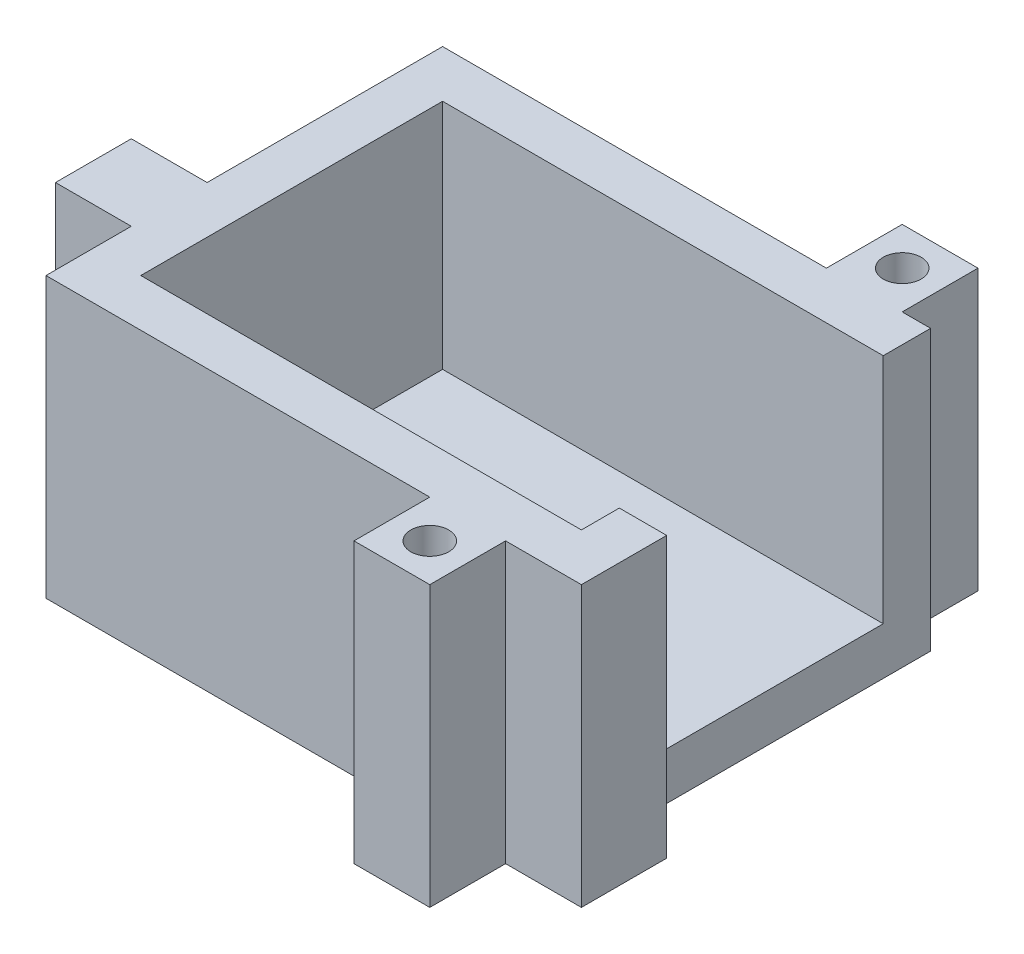
ISO-10303-21;
HEADER;
FILE_DESCRIPTION(('STEP AP214'),'2;1');
FILE_NAME('part.step','',(''),(''),'','','');
FILE_SCHEMA(('AUTOMOTIVE_DESIGN { 1 0 10303 214 1 1 1 1 }'));
ENDSEC;
DATA;
#1=APPLICATION_CONTEXT('core data for automotive mechanical design processes');
#2=APPLICATION_PROTOCOL_DEFINITION('international standard','automotive_design',2000,#1);
#3=PRODUCT_CONTEXT('',#1,'mechanical');
#4=PRODUCT('Part','Part','',(#3));
#5=PRODUCT_RELATED_PRODUCT_CATEGORY('part','',(#4));
#6=PRODUCT_DEFINITION_FORMATION('','',#4);
#7=PRODUCT_DEFINITION_CONTEXT('part definition',#1,'design');
#8=PRODUCT_DEFINITION('design','',#6,#7);
#9=PRODUCT_DEFINITION_SHAPE('','',#8);
#10=(LENGTH_UNIT() NAMED_UNIT(*) SI_UNIT(.MILLI.,.METRE.));
#11=(NAMED_UNIT(*) PLANE_ANGLE_UNIT() SI_UNIT($,.RADIAN.));
#12=(NAMED_UNIT(*) SI_UNIT($,.STERADIAN.) SOLID_ANGLE_UNIT());
#13=UNCERTAINTY_MEASURE_WITH_UNIT(LENGTH_MEASURE(1.E-05),#10,'distance_accuracy_value','');
#14=(GEOMETRIC_REPRESENTATION_CONTEXT(3) GLOBAL_UNCERTAINTY_ASSIGNED_CONTEXT((#13)) GLOBAL_UNIT_ASSIGNED_CONTEXT((#10,
#11,#12)) REPRESENTATION_CONTEXT('',''));
#15=CARTESIAN_POINT('',(0.,0.,0.));
#16=DIRECTION('',(0.,0.,1.));
#17=DIRECTION('',(1.,0.,0.));
#18=AXIS2_PLACEMENT_3D('',#15,#16,#17);
#19=CARTESIAN_POINT('',(0.,24.5,41.85));
#20=DIRECTION('',(1.,0.,0.));
#21=DIRECTION('',(0.,0.,-1.));
#22=AXIS2_PLACEMENT_3D('',#19,#20,#21);
#23=PLANE('',#22);
#24=DIRECTION('',(0.,1.,0.));
#25=VECTOR('',#24,1.);
#26=CARTESIAN_POINT('',(0.,24.5,32.85));
#27=LINE('',#26,#25);
#28=CARTESIAN_POINT('',(0.,-5.,32.85));
#29=VERTEX_POINT('',#28);
#30=CARTESIAN_POINT('',(0.,24.5,32.85));
#31=VERTEX_POINT('',#30);
#32=EDGE_CURVE('E223',#29,#31,#27,.T.);
#33=ORIENTED_EDGE('',*,*,#32,.F.);
#34=DIRECTION('',(0.,0.,-1.));
#35=VECTOR('',#34,1.);
#36=CARTESIAN_POINT('',(0.,-5.,41.85));
#37=LINE('',#36,#35);
#38=CARTESIAN_POINT('',(0.,-5.,41.85));
#39=VERTEX_POINT('',#38);
#40=EDGE_CURVE('E316',#39,#29,#37,.T.);
#41=ORIENTED_EDGE('',*,*,#40,.F.);
#42=DIRECTION('',(0.,-1.,0.));
#43=VECTOR('',#42,1.);
#44=CARTESIAN_POINT('',(0.,24.5,41.85));
#45=LINE('',#44,#43);
#46=CARTESIAN_POINT('',(0.,24.5,41.85));
#47=VERTEX_POINT('',#46);
#48=EDGE_CURVE('E44',#47,#39,#45,.T.);
#49=ORIENTED_EDGE('',*,*,#48,.F.);
#50=DIRECTION('',(0.,0.,1.));
#51=VECTOR('',#50,1.);
#52=CARTESIAN_POINT('',(0.,24.5,41.85));
#53=LINE('',#52,#51);
#54=EDGE_CURVE('E51',#31,#47,#53,.T.);
#55=ORIENTED_EDGE('',*,*,#54,.F.);
#56=EDGE_LOOP('',(#33,#41,#49,#55));
#57=FACE_BOUND('',#56,.T.);
#58=ADVANCED_FACE('F37',(#57),#23,.F.);
#59=DIRECTION('',(0.,-1.,0.));
#60=VECTOR('',#59,1.);
#61=CARTESIAN_POINT('',(0.,24.5,24.85));
#62=LINE('',#61,#60);
#63=CARTESIAN_POINT('',(0.,24.5,24.85));
#64=VERTEX_POINT('',#63);
#65=CARTESIAN_POINT('',(0.,-5.,24.85));
#66=VERTEX_POINT('',#65);
#67=EDGE_CURVE('E59',#64,#66,#62,.T.);
#68=ORIENTED_EDGE('',*,*,#67,.F.);
#69=CARTESIAN_POINT('',(0.,24.5,0.));
#70=VERTEX_POINT('',#69);
#71=EDGE_CURVE('E322',#70,#64,#53,.T.);
#72=ORIENTED_EDGE('',*,*,#71,.F.);
#73=DIRECTION('',(0.,-1.,0.));
#74=VECTOR('',#73,1.);
#75=CARTESIAN_POINT('',(0.,24.5,0.));
#76=LINE('',#75,#74);
#77=CARTESIAN_POINT('',(0.,-5.,0.));
#78=VERTEX_POINT('',#77);
#79=EDGE_CURVE('E345',#70,#78,#76,.T.);
#80=ORIENTED_EDGE('',*,*,#79,.T.);
#81=EDGE_CURVE('E315',#66,#78,#37,.T.);
#82=ORIENTED_EDGE('',*,*,#81,.F.);
#83=EDGE_LOOP('',(#68,#72,#80,#82));
#84=FACE_BOUND('',#83,.T.);
#85=ADVANCED_FACE('F416',(#84),#23,.F.);
#86=CARTESIAN_POINT('',(0.,24.5,0.));
#87=DIRECTION('',(0.,-1.,0.));
#88=DIRECTION('',(0.,0.,-1.));
#89=AXIS2_PLACEMENT_3D('',#86,#87,#88);
#90=PLANE('',#89);
#91=CARTESIAN_POINT('',(44.5,24.5,45.85));
#92=DIRECTION('',(0.,1.,0.));
#93=DIRECTION('',(0.,0.,1.));
#94=AXIS2_PLACEMENT_3D('',#91,#92,#93);
#95=CIRCLE('',#94,2.);
#96=CARTESIAN_POINT('',(44.5,24.5,47.85));
#97=VERTEX_POINT('',#96);
#98=EDGE_CURVE('E263',#97,#97,#95,.T.);
#99=ORIENTED_EDGE('',*,*,#98,.F.);
#100=EDGE_LOOP('',(#99));
#101=FACE_BOUND('',#100,.T.);
#102=DIRECTION('',(1.,0.,0.));
#103=VECTOR('',#102,1.);
#104=CARTESIAN_POINT('',(56.5,24.5,41.85));
#105=LINE('',#104,#103);
#106=CARTESIAN_POINT('',(40.5,24.5,41.85));
#107=VERTEX_POINT('',#106);
#108=EDGE_CURVE('E325',#47,#107,#105,.T.);
#109=ORIENTED_EDGE('',*,*,#108,.T.);
#110=DIRECTION('',(0.,0.,1.));
#111=VECTOR('',#110,1.);
#112=CARTESIAN_POINT('',(40.5,24.5,0.));
#113=LINE('',#112,#111);
#114=CARTESIAN_POINT('',(40.5,24.5,49.85));
#115=VERTEX_POINT('',#114);
#116=EDGE_CURVE('E207',#107,#115,#113,.T.);
#117=ORIENTED_EDGE('',*,*,#116,.T.);
#118=DIRECTION('',(-1.,0.,0.));
#119=VECTOR('',#118,1.);
#120=CARTESIAN_POINT('',(48.5,24.5,49.85));
#121=LINE('',#120,#119);
#122=CARTESIAN_POINT('',(48.5,24.5,49.85));
#123=VERTEX_POINT('',#122);
#124=EDGE_CURVE('E271',#123,#115,#121,.T.);
#125=ORIENTED_EDGE('',*,*,#124,.F.);
#126=DIRECTION('',(0.,0.,-1.));
#127=VECTOR('',#126,1.);
#128=CARTESIAN_POINT('',(48.5,24.5,49.85));
#129=LINE('',#128,#127);
#130=CARTESIAN_POINT('',(48.5,24.5,41.85));
#131=VERTEX_POINT('',#130);
#132=EDGE_CURVE('E280',#123,#131,#129,.T.);
#133=ORIENTED_EDGE('',*,*,#132,.T.);
#134=CARTESIAN_POINT('',(56.5,24.5,41.85));
#135=VERTEX_POINT('',#134);
#136=EDGE_CURVE('E324',#131,#135,#105,.T.);
#137=ORIENTED_EDGE('',*,*,#136,.T.);
#138=DIRECTION('',(0.,0.,-1.));
#139=VECTOR('',#138,1.);
#140=CARTESIAN_POINT('',(56.5,24.5,32.85));
#141=LINE('',#140,#139);
#142=CARTESIAN_POINT('',(56.5,24.5,32.85));
#143=VERTEX_POINT('',#142);
#144=EDGE_CURVE('E327',#135,#143,#141,.T.);
#145=ORIENTED_EDGE('',*,*,#144,.T.);
#146=DIRECTION('',(-1.,0.,0.));
#147=VECTOR('',#146,1.);
#148=CARTESIAN_POINT('',(51.5,24.5,32.85));
#149=LINE('',#148,#147);
#150=CARTESIAN_POINT('',(51.5,24.5,32.85));
#151=VERTEX_POINT('',#150);
#152=EDGE_CURVE('E329',#143,#151,#149,.T.);
#153=ORIENTED_EDGE('',*,*,#152,.T.);
#154=DIRECTION('',(0.,0.,1.));
#155=VECTOR('',#154,1.);
#156=CARTESIAN_POINT('',(51.5,24.5,36.85));
#157=LINE('',#156,#155);
#158=CARTESIAN_POINT('',(51.5,24.5,36.85));
#159=VERTEX_POINT('',#158);
#160=EDGE_CURVE('E331',#151,#159,#157,.T.);
#161=ORIENTED_EDGE('',*,*,#160,.T.);
#162=DIRECTION('',(-1.,0.,0.));
#163=VECTOR('',#162,1.);
#164=CARTESIAN_POINT('',(4.99999999999999,24.5,36.85));
#165=LINE('',#164,#163);
#166=CARTESIAN_POINT('',(4.99999999999999,24.5,36.85));
#167=VERTEX_POINT('',#166);
#168=EDGE_CURVE('E333',#159,#167,#165,.T.);
#169=ORIENTED_EDGE('',*,*,#168,.T.);
#170=DIRECTION('',(0.,0.,-1.));
#171=VECTOR('',#170,1.);
#172=CARTESIAN_POINT('',(4.99999999999999,24.5,5.));
#173=LINE('',#172,#171);
#174=CARTESIAN_POINT('',(4.99999999999999,24.5,5.));
#175=VERTEX_POINT('',#174);
#176=EDGE_CURVE('E335',#167,#175,#173,.T.);
#177=ORIENTED_EDGE('',*,*,#176,.T.);
#178=DIRECTION('',(1.,0.,0.));
#179=VECTOR('',#178,1.);
#180=CARTESIAN_POINT('',(51.5,24.5,5.));
#181=LINE('',#180,#179);
#182=CARTESIAN_POINT('',(51.5,24.5,5.));
#183=VERTEX_POINT('',#182);
#184=EDGE_CURVE('E337',#175,#183,#181,.T.);
#185=ORIENTED_EDGE('',*,*,#184,.T.);
#186=DIRECTION('',(0.,0.,-1.));
#187=VECTOR('',#186,1.);
#188=CARTESIAN_POINT('',(51.5,24.5,0.));
#189=LINE('',#188,#187);
#190=CARTESIAN_POINT('',(51.5,24.5,0.));
#191=VERTEX_POINT('',#190);
#192=EDGE_CURVE('E339',#183,#191,#189,.T.);
#193=ORIENTED_EDGE('',*,*,#192,.T.);
#194=DIRECTION('',(-1.,0.,0.));
#195=VECTOR('',#194,1.);
#196=CARTESIAN_POINT('',(0.,24.5,0.));
#197=LINE('',#196,#195);
#198=CARTESIAN_POINT('',(48.5,24.5,0.));
#199=VERTEX_POINT('',#198);
#200=EDGE_CURVE('E342',#191,#199,#197,.T.);
#201=ORIENTED_EDGE('',*,*,#200,.T.);
#202=DIRECTION('',(0.,0.,1.));
#203=VECTOR('',#202,1.);
#204=CARTESIAN_POINT('',(48.5,24.5,-8.));
#205=LINE('',#204,#203);
#206=CARTESIAN_POINT('',(48.5,24.5,-8.));
#207=VERTEX_POINT('',#206);
#208=EDGE_CURVE('E293',#207,#199,#205,.T.);
#209=ORIENTED_EDGE('',*,*,#208,.F.);
#210=DIRECTION('',(1.,0.,0.));
#211=VECTOR('',#210,1.);
#212=CARTESIAN_POINT('',(48.5,24.5,-8.));
#213=LINE('',#212,#211);
#214=CARTESIAN_POINT('',(40.5,24.5,-8.));
#215=VERTEX_POINT('',#214);
#216=EDGE_CURVE('E291',#215,#207,#213,.T.);
#217=ORIENTED_EDGE('',*,*,#216,.F.);
#218=DIRECTION('',(0.,0.,1.));
#219=VECTOR('',#218,1.);
#220=CARTESIAN_POINT('',(40.5,24.5,-8.));
#221=LINE('',#220,#219);
#222=CARTESIAN_POINT('',(40.5,24.5,0.));
#223=VERTEX_POINT('',#222);
#224=EDGE_CURVE('E297',#215,#223,#221,.T.);
#225=ORIENTED_EDGE('',*,*,#224,.T.);
#226=EDGE_CURVE('E341',#223,#70,#197,.T.);
#227=ORIENTED_EDGE('',*,*,#226,.T.);
#228=ORIENTED_EDGE('',*,*,#71,.T.);
#229=DIRECTION('',(1.,0.,0.));
#230=VECTOR('',#229,1.);
#231=CARTESIAN_POINT('',(-8.,24.5,24.85));
#232=LINE('',#231,#230);
#233=CARTESIAN_POINT('',(-8.,24.5,24.85));
#234=VERTEX_POINT('',#233);
#235=EDGE_CURVE('E244',#234,#64,#232,.T.);
#236=ORIENTED_EDGE('',*,*,#235,.F.);
#237=DIRECTION('',(0.,0.,-1.));
#238=VECTOR('',#237,1.);
#239=CARTESIAN_POINT('',(-8.,24.5,32.85));
#240=LINE('',#239,#238);
#241=CARTESIAN_POINT('',(-8.,24.5,32.85));
#242=VERTEX_POINT('',#241);
#243=EDGE_CURVE('E229',#242,#234,#240,.T.);
#244=ORIENTED_EDGE('',*,*,#243,.F.);
#245=DIRECTION('',(1.,0.,0.));
#246=VECTOR('',#245,1.);
#247=CARTESIAN_POINT('',(-8.,24.5,32.85));
#248=LINE('',#247,#246);
#249=EDGE_CURVE('E247',#242,#31,#248,.T.);
#250=ORIENTED_EDGE('',*,*,#249,.T.);
#251=ORIENTED_EDGE('',*,*,#54,.T.);
#252=EDGE_LOOP('',(#109,#117,#125,#133,#137,#145,#153,#161,#169,#177,#185,#193,#201,#209,#217,
#225,#227,#228,#236,#244,#250,#251));
#253=FACE_BOUND('',#252,.T.);
#254=CARTESIAN_POINT('',(44.5,24.5,-4.));
#255=DIRECTION('',(0.,1.,0.));
#256=DIRECTION('',(0.,0.,1.));
#257=AXIS2_PLACEMENT_3D('',#254,#255,#256);
#258=CIRCLE('',#257,2.);
#259=CARTESIAN_POINT('',(44.5,24.5,-2.));
#260=VERTEX_POINT('',#259);
#261=EDGE_CURVE('E260',#260,#260,#258,.T.);
#262=ORIENTED_EDGE('',*,*,#261,.F.);
#263=EDGE_LOOP('',(#262));
#264=FACE_BOUND('',#263,.T.);
#265=ADVANCED_FACE('F399',(#101,#253,#264),#90,.F.);
#266=CARTESIAN_POINT('',(56.5,24.5,41.85));
#267=DIRECTION('',(0.,0.,-1.));
#268=DIRECTION('',(-1.,0.,0.));
#269=AXIS2_PLACEMENT_3D('',#266,#267,#268);
#270=PLANE('',#269);
#271=DIRECTION('',(-1.,0.,0.));
#272=VECTOR('',#271,1.);
#273=CARTESIAN_POINT('',(0.,-5.,41.85));
#274=LINE('',#273,#272);
#275=CARTESIAN_POINT('',(56.5,-5.,41.85));
#276=VERTEX_POINT('',#275);
#277=CARTESIAN_POINT('',(48.5,-5.,41.85));
#278=VERTEX_POINT('',#277);
#279=EDGE_CURVE('E198',#276,#278,#274,.T.);
#280=ORIENTED_EDGE('',*,*,#279,.F.);
#281=DIRECTION('',(0.,-1.,0.));
#282=VECTOR('',#281,1.);
#283=CARTESIAN_POINT('',(56.5,24.5,41.85));
#284=LINE('',#283,#282);
#285=EDGE_CURVE('E378',#135,#276,#284,.T.);
#286=ORIENTED_EDGE('',*,*,#285,.F.);
#287=ORIENTED_EDGE('',*,*,#136,.F.);
#288=DIRECTION('',(0.,1.,0.));
#289=VECTOR('',#288,1.);
#290=CARTESIAN_POINT('',(48.5,24.5,41.85));
#291=LINE('',#290,#289);
#292=EDGE_CURVE('E259',#278,#131,#291,.T.);
#293=ORIENTED_EDGE('',*,*,#292,.F.);
#294=EDGE_LOOP('',(#280,#286,#287,#293));
#295=FACE_BOUND('',#294,.T.);
#296=ADVANCED_FACE('F391',(#295),#270,.F.);
#297=CARTESIAN_POINT('',(40.5,-5.,41.85));
#298=VERTEX_POINT('',#297);
#299=EDGE_CURVE('E189',#298,#39,#274,.T.);
#300=ORIENTED_EDGE('',*,*,#299,.F.);
#301=DIRECTION('',(0.,-1.,0.));
#302=VECTOR('',#301,1.);
#303=CARTESIAN_POINT('',(40.5,142.,41.85));
#304=LINE('',#303,#302);
#305=EDGE_CURVE('E193',#107,#298,#304,.T.);
#306=ORIENTED_EDGE('',*,*,#305,.F.);
#307=ORIENTED_EDGE('',*,*,#108,.F.);
#308=ORIENTED_EDGE('',*,*,#48,.T.);
#309=EDGE_LOOP('',(#300,#306,#307,#308));
#310=FACE_BOUND('',#309,.T.);
#311=ADVANCED_FACE('F191',(#310),#270,.F.);
#312=CARTESIAN_POINT('',(0.,24.5,0.));
#313=DIRECTION('',(0.,0.,1.));
#314=DIRECTION('',(1.,0.,0.));
#315=AXIS2_PLACEMENT_3D('',#312,#313,#314);
#316=PLANE('',#315);
#317=DIRECTION('',(0.,-1.,0.));
#318=VECTOR('',#317,1.);
#319=CARTESIAN_POINT('',(51.5,24.5,0.));
#320=LINE('',#319,#318);
#321=CARTESIAN_POINT('',(51.5,-5.,0.));
#322=VERTEX_POINT('',#321);
#323=EDGE_CURVE('E359',#191,#322,#320,.T.);
#324=ORIENTED_EDGE('',*,*,#323,.T.);
#325=DIRECTION('',(1.,0.,0.));
#326=VECTOR('',#325,1.);
#327=CARTESIAN_POINT('',(0.,-5.,0.));
#328=LINE('',#327,#326);
#329=CARTESIAN_POINT('',(48.5,-5.,0.));
#330=VERTEX_POINT('',#329);
#331=EDGE_CURVE('E318',#330,#322,#328,.T.);
#332=ORIENTED_EDGE('',*,*,#331,.F.);
#333=DIRECTION('',(0.,-1.,0.));
#334=VECTOR('',#333,1.);
#335=CARTESIAN_POINT('',(48.5,24.5,0.));
#336=LINE('',#335,#334);
#337=EDGE_CURVE('E282',#199,#330,#336,.T.);
#338=ORIENTED_EDGE('',*,*,#337,.F.);
#339=ORIENTED_EDGE('',*,*,#200,.F.);
#340=EDGE_LOOP('',(#324,#332,#338,#339));
#341=FACE_BOUND('',#340,.T.);
#342=ADVANCED_FACE('F438',(#341),#316,.F.);
#343=DIRECTION('',(0.,1.,0.));
#344=VECTOR('',#343,1.);
#345=CARTESIAN_POINT('',(40.5,24.5,0.));
#346=LINE('',#345,#344);
#347=CARTESIAN_POINT('',(40.5,-5.,0.));
#348=VERTEX_POINT('',#347);
#349=EDGE_CURVE('E287',#348,#223,#346,.T.);
#350=ORIENTED_EDGE('',*,*,#349,.F.);
#351=EDGE_CURVE('E199',#78,#348,#328,.T.);
#352=ORIENTED_EDGE('',*,*,#351,.F.);
#353=ORIENTED_EDGE('',*,*,#79,.F.);
#354=ORIENTED_EDGE('',*,*,#226,.F.);
#355=EDGE_LOOP('',(#350,#352,#353,#354));
#356=FACE_BOUND('',#355,.T.);
#357=ADVANCED_FACE('F420',(#356),#316,.F.);
#358=CARTESIAN_POINT('',(0.,0.,0.));
#359=DIRECTION('',(0.,-1.,0.));
#360=DIRECTION('',(0.,0.,-1.));
#361=AXIS2_PLACEMENT_3D('',#358,#359,#360);
#362=PLANE('',#361);
#363=DIRECTION('',(0.,0.,1.));
#364=VECTOR('',#363,1.);
#365=CARTESIAN_POINT('',(51.5,0.,36.85));
#366=LINE('',#365,#364);
#367=CARTESIAN_POINT('',(51.5,0.,32.85));
#368=VERTEX_POINT('',#367);
#369=CARTESIAN_POINT('',(51.5,0.,36.85));
#370=VERTEX_POINT('',#369);
#371=EDGE_CURVE('E321',#368,#370,#366,.T.);
#372=ORIENTED_EDGE('',*,*,#371,.F.);
#373=DIRECTION('',(0.,0.,1.));
#374=VECTOR('',#373,1.);
#375=CARTESIAN_POINT('',(51.5,0.,5.));
#376=LINE('',#375,#374);
#377=CARTESIAN_POINT('',(51.5,0.,5.));
#378=VERTEX_POINT('',#377);
#379=EDGE_CURVE('E305',#378,#368,#376,.T.);
#380=ORIENTED_EDGE('',*,*,#379,.F.);
#381=DIRECTION('',(1.,0.,0.));
#382=VECTOR('',#381,1.);
#383=CARTESIAN_POINT('',(51.5,0.,5.));
#384=LINE('',#383,#382);
#385=CARTESIAN_POINT('',(4.99999999999999,0.,5.));
#386=VERTEX_POINT('',#385);
#387=EDGE_CURVE('E354',#386,#378,#384,.T.);
#388=ORIENTED_EDGE('',*,*,#387,.F.);
#389=DIRECTION('',(0.,0.,-1.));
#390=VECTOR('',#389,1.);
#391=CARTESIAN_POINT('',(4.99999999999999,0.,5.));
#392=LINE('',#391,#390);
#393=CARTESIAN_POINT('',(4.99999999999999,0.,36.85));
#394=VERTEX_POINT('',#393);
#395=EDGE_CURVE('E351',#394,#386,#392,.T.);
#396=ORIENTED_EDGE('',*,*,#395,.F.);
#397=DIRECTION('',(-1.,0.,0.));
#398=VECTOR('',#397,1.);
#399=CARTESIAN_POINT('',(4.99999999999999,0.,36.85));
#400=LINE('',#399,#398);
#401=EDGE_CURVE('E348',#370,#394,#400,.T.);
#402=ORIENTED_EDGE('',*,*,#401,.F.);
#403=EDGE_LOOP('',(#372,#380,#388,#396,#402));
#404=FACE_BOUND('',#403,.T.);
#405=ADVANCED_FACE('F452',(#404),#362,.F.);
#406=CARTESIAN_POINT('',(56.5,24.5,32.85));
#407=DIRECTION('',(-1.,0.,0.));
#408=DIRECTION('',(0.,0.,1.));
#409=AXIS2_PLACEMENT_3D('',#406,#407,#408);
#410=PLANE('',#409);
#411=ORIENTED_EDGE('',*,*,#285,.T.);
#412=DIRECTION('',(0.,0.,-1.));
#413=VECTOR('',#412,1.);
#414=CARTESIAN_POINT('',(56.5,-5.,0.));
#415=LINE('',#414,#413);
#416=CARTESIAN_POINT('',(56.5,-5.00000000000001,32.85));
#417=VERTEX_POINT('',#416);
#418=EDGE_CURVE('E11',#276,#417,#415,.T.);
#419=ORIENTED_EDGE('',*,*,#418,.T.);
#420=DIRECTION('',(0.,-1.,0.));
#421=VECTOR('',#420,1.);
#422=CARTESIAN_POINT('',(56.5,24.5,32.85));
#423=LINE('',#422,#421);
#424=EDGE_CURVE('E376',#143,#417,#423,.T.);
#425=ORIENTED_EDGE('',*,*,#424,.F.);
#426=ORIENTED_EDGE('',*,*,#144,.F.);
#427=EDGE_LOOP('',(#411,#419,#425,#426));
#428=FACE_BOUND('',#427,.T.);
#429=ADVANCED_FACE('F383',(#428),#410,.F.);
#430=CARTESIAN_POINT('',(51.5,24.5,32.85));
#431=DIRECTION('',(0.,0.,1.));
#432=DIRECTION('',(1.,0.,0.));
#433=AXIS2_PLACEMENT_3D('',#430,#431,#432);
#434=PLANE('',#433);
#435=ORIENTED_EDGE('',*,*,#424,.T.);
#436=DIRECTION('',(-1.,0.,0.));
#437=VECTOR('',#436,1.);
#438=CARTESIAN_POINT('',(0.,-5.,32.85));
#439=LINE('',#438,#437);
#440=CARTESIAN_POINT('',(51.5,-5.,32.85));
#441=VERTEX_POINT('',#440);
#442=EDGE_CURVE('E310',#417,#441,#439,.T.);
#443=ORIENTED_EDGE('',*,*,#442,.T.);
#444=DIRECTION('',(0.,1.,0.));
#445=VECTOR('',#444,1.);
#446=CARTESIAN_POINT('',(51.5,-26.,32.85));
#447=LINE('',#446,#445);
#448=EDGE_CURVE('E307',#441,#368,#447,.T.);
#449=ORIENTED_EDGE('',*,*,#448,.T.);
#450=DIRECTION('',(0.,-1.,0.));
#451=VECTOR('',#450,1.);
#452=CARTESIAN_POINT('',(51.5,24.5,32.85));
#453=LINE('',#452,#451);
#454=EDGE_CURVE('E373',#151,#368,#453,.T.);
#455=ORIENTED_EDGE('',*,*,#454,.F.);
#456=ORIENTED_EDGE('',*,*,#152,.F.);
#457=EDGE_LOOP('',(#435,#443,#449,#455,#456));
#458=FACE_BOUND('',#457,.T.);
#459=ADVANCED_FACE('F448',(#458),#434,.F.);
#460=CARTESIAN_POINT('',(51.5,24.5,36.85));
#461=DIRECTION('',(1.,0.,0.));
#462=DIRECTION('',(0.,0.,-1.));
#463=AXIS2_PLACEMENT_3D('',#460,#461,#462);
#464=PLANE('',#463);
#465=ORIENTED_EDGE('',*,*,#371,.T.);
#466=DIRECTION('',(0.,-1.,0.));
#467=VECTOR('',#466,1.);
#468=CARTESIAN_POINT('',(51.5,24.5,36.85));
#469=LINE('',#468,#467);
#470=EDGE_CURVE('E370',#159,#370,#469,.T.);
#471=ORIENTED_EDGE('',*,*,#470,.F.);
#472=ORIENTED_EDGE('',*,*,#160,.F.);
#473=ORIENTED_EDGE('',*,*,#454,.T.);
#474=EDGE_LOOP('',(#465,#471,#472,#473));
#475=FACE_BOUND('',#474,.T.);
#476=ADVANCED_FACE('F455',(#475),#464,.F.);
#477=CARTESIAN_POINT('',(4.99999999999999,24.5,36.85));
#478=DIRECTION('',(0.,0.,1.));
#479=DIRECTION('',(1.,0.,0.));
#480=AXIS2_PLACEMENT_3D('',#477,#478,#479);
#481=PLANE('',#480);
#482=DIRECTION('',(0.,-1.,0.));
#483=VECTOR('',#482,1.);
#484=CARTESIAN_POINT('',(4.99999999999999,24.5,36.85));
#485=LINE('',#484,#483);
#486=EDGE_CURVE('E367',#167,#394,#485,.T.);
#487=ORIENTED_EDGE('',*,*,#486,.F.);
#488=ORIENTED_EDGE('',*,*,#168,.F.);
#489=ORIENTED_EDGE('',*,*,#470,.T.);
#490=ORIENTED_EDGE('',*,*,#401,.T.);
#491=EDGE_LOOP('',(#487,#488,#489,#490));
#492=FACE_BOUND('',#491,.T.);
#493=ADVANCED_FACE('F461',(#492),#481,.F.);
#494=CARTESIAN_POINT('',(4.99999999999999,24.5,5.));
#495=DIRECTION('',(-1.,0.,0.));
#496=DIRECTION('',(0.,0.,1.));
#497=AXIS2_PLACEMENT_3D('',#494,#495,#496);
#498=PLANE('',#497);
#499=ORIENTED_EDGE('',*,*,#395,.T.);
#500=DIRECTION('',(0.,-1.,0.));
#501=VECTOR('',#500,1.);
#502=CARTESIAN_POINT('',(4.99999999999999,24.5,5.));
#503=LINE('',#502,#501);
#504=EDGE_CURVE('E364',#175,#386,#503,.T.);
#505=ORIENTED_EDGE('',*,*,#504,.F.);
#506=ORIENTED_EDGE('',*,*,#176,.F.);
#507=ORIENTED_EDGE('',*,*,#486,.T.);
#508=EDGE_LOOP('',(#499,#505,#506,#507));
#509=FACE_BOUND('',#508,.T.);
#510=ADVANCED_FACE('F463',(#509),#498,.F.);
#511=CARTESIAN_POINT('',(51.5,24.5,5.));
#512=DIRECTION('',(0.,0.,-1.));
#513=DIRECTION('',(-1.,0.,0.));
#514=AXIS2_PLACEMENT_3D('',#511,#512,#513);
#515=PLANE('',#514);
#516=ORIENTED_EDGE('',*,*,#387,.T.);
#517=DIRECTION('',(0.,-1.,0.));
#518=VECTOR('',#517,1.);
#519=CARTESIAN_POINT('',(51.5,24.5,5.));
#520=LINE('',#519,#518);
#521=EDGE_CURVE('E361',#183,#378,#520,.T.);
#522=ORIENTED_EDGE('',*,*,#521,.F.);
#523=ORIENTED_EDGE('',*,*,#184,.F.);
#524=ORIENTED_EDGE('',*,*,#504,.T.);
#525=EDGE_LOOP('',(#516,#522,#523,#524));
#526=FACE_BOUND('',#525,.T.);
#527=ADVANCED_FACE('F467',(#526),#515,.F.);
#528=CARTESIAN_POINT('',(51.5,24.5,0.));
#529=DIRECTION('',(-1.,0.,0.));
#530=DIRECTION('',(0.,0.,1.));
#531=AXIS2_PLACEMENT_3D('',#528,#529,#530);
#532=PLANE('',#531);
#533=ORIENTED_EDGE('',*,*,#521,.T.);
#534=ORIENTED_EDGE('',*,*,#379,.T.);
#535=ORIENTED_EDGE('',*,*,#448,.F.);
#536=DIRECTION('',(0.,0.,-1.));
#537=VECTOR('',#536,1.);
#538=CARTESIAN_POINT('',(51.5,-5.,0.));
#539=LINE('',#538,#537);
#540=EDGE_CURVE('E312',#441,#322,#539,.T.);
#541=ORIENTED_EDGE('',*,*,#540,.T.);
#542=ORIENTED_EDGE('',*,*,#323,.F.);
#543=ORIENTED_EDGE('',*,*,#192,.F.);
#544=EDGE_LOOP('',(#533,#534,#535,#541,#542,#543));
#545=FACE_BOUND('',#544,.T.);
#546=ADVANCED_FACE('F444',(#545),#532,.F.);
#547=CARTESIAN_POINT('',(0.,-5.,0.));
#548=DIRECTION('',(0.,-1.,0.));
#549=DIRECTION('',(0.,0.,-1.));
#550=AXIS2_PLACEMENT_3D('',#547,#548,#549);
#551=PLANE('',#550);
#552=DIRECTION('',(0.,0.,1.));
#553=VECTOR('',#552,1.);
#554=CARTESIAN_POINT('',(40.5,-5.,49.85));
#555=LINE('',#554,#553);
#556=CARTESIAN_POINT('',(40.5,-5.,49.85));
#557=VERTEX_POINT('',#556);
#558=EDGE_CURVE('E204',#298,#557,#555,.T.);
#559=ORIENTED_EDGE('',*,*,#558,.F.);
#560=ORIENTED_EDGE('',*,*,#299,.T.);
#561=ORIENTED_EDGE('',*,*,#40,.T.);
#562=DIRECTION('',(1.,0.,0.));
#563=VECTOR('',#562,1.);
#564=CARTESIAN_POINT('',(-8.,-5.,32.85));
#565=LINE('',#564,#563);
#566=CARTESIAN_POINT('',(-8.,-5.,32.85));
#567=VERTEX_POINT('',#566);
#568=EDGE_CURVE('E235',#567,#29,#565,.T.);
#569=ORIENTED_EDGE('',*,*,#568,.F.);
#570=DIRECTION('',(0.,0.,1.));
#571=VECTOR('',#570,1.);
#572=CARTESIAN_POINT('',(-8.,-5.,32.85));
#573=LINE('',#572,#571);
#574=CARTESIAN_POINT('',(-8.,-5.,24.85));
#575=VERTEX_POINT('',#574);
#576=EDGE_CURVE('E233',#575,#567,#573,.T.);
#577=ORIENTED_EDGE('',*,*,#576,.F.);
#578=DIRECTION('',(1.,0.,0.));
#579=VECTOR('',#578,1.);
#580=CARTESIAN_POINT('',(-8.,-5.,24.85));
#581=LINE('',#580,#579);
#582=EDGE_CURVE('E241',#575,#66,#581,.T.);
#583=ORIENTED_EDGE('',*,*,#582,.T.);
#584=ORIENTED_EDGE('',*,*,#81,.T.);
#585=ORIENTED_EDGE('',*,*,#351,.T.);
#586=DIRECTION('',(0.,0.,1.));
#587=VECTOR('',#586,1.);
#588=CARTESIAN_POINT('',(40.5,-5.,-8.));
#589=LINE('',#588,#587);
#590=CARTESIAN_POINT('',(40.5,-5.,-8.));
#591=VERTEX_POINT('',#590);
#592=EDGE_CURVE('E300',#591,#348,#589,.T.);
#593=ORIENTED_EDGE('',*,*,#592,.F.);
#594=DIRECTION('',(-1.,0.,0.));
#595=VECTOR('',#594,1.);
#596=CARTESIAN_POINT('',(48.5,-5.,-8.));
#597=LINE('',#596,#595);
#598=CARTESIAN_POINT('',(48.5,-5.,-8.));
#599=VERTEX_POINT('',#598);
#600=EDGE_CURVE('E286',#599,#591,#597,.T.);
#601=ORIENTED_EDGE('',*,*,#600,.F.);
#602=DIRECTION('',(0.,0.,1.));
#603=VECTOR('',#602,1.);
#604=CARTESIAN_POINT('',(48.5,-5.,-8.));
#605=LINE('',#604,#603);
#606=EDGE_CURVE('E302',#599,#330,#605,.T.);
#607=ORIENTED_EDGE('',*,*,#606,.T.);
#608=ORIENTED_EDGE('',*,*,#331,.T.);
#609=ORIENTED_EDGE('',*,*,#540,.F.);
#610=ORIENTED_EDGE('',*,*,#442,.F.);
#611=ORIENTED_EDGE('',*,*,#418,.F.);
#612=ORIENTED_EDGE('',*,*,#279,.T.);
#613=DIRECTION('',(0.,0.,-1.));
#614=VECTOR('',#613,1.);
#615=CARTESIAN_POINT('',(48.5,-5.,49.85));
#616=LINE('',#615,#614);
#617=CARTESIAN_POINT('',(48.5,-5.,49.85));
#618=VERTEX_POINT('',#617);
#619=EDGE_CURVE('E275',#618,#278,#616,.T.);
#620=ORIENTED_EDGE('',*,*,#619,.F.);
#621=DIRECTION('',(1.,0.,0.));
#622=VECTOR('',#621,1.);
#623=CARTESIAN_POINT('',(48.5,-5.,49.85));
#624=LINE('',#623,#622);
#625=EDGE_CURVE('E214',#557,#618,#624,.T.);
#626=ORIENTED_EDGE('',*,*,#625,.F.);
#627=EDGE_LOOP('',(#559,#560,#561,#569,#577,#583,#584,#585,#593,#601,#607,#608,#609,#610,#611,
#612,#620,#626));
#628=FACE_BOUND('',#627,.T.);
#629=CARTESIAN_POINT('',(-4.,-5.,28.85));
#630=DIRECTION('',(0.,-1.,0.));
#631=DIRECTION('',(0.,0.,-1.));
#632=AXIS2_PLACEMENT_3D('',#629,#630,#631);
#633=CIRCLE('',#632,2.5);
#634=CARTESIAN_POINT('',(-4.,-5.,26.35));
#635=VERTEX_POINT('',#634);
#636=EDGE_CURVE('E219',#635,#635,#633,.T.);
#637=ORIENTED_EDGE('',*,*,#636,.F.);
#638=EDGE_LOOP('',(#637));
#639=FACE_BOUND('',#638,.T.);
#640=CARTESIAN_POINT('',(44.5,-5.,-4.));
#641=DIRECTION('',(0.,-1.,0.));
#642=DIRECTION('',(0.,0.,-1.));
#643=AXIS2_PLACEMENT_3D('',#640,#641,#642);
#644=CIRCLE('',#643,2.5);
#645=CARTESIAN_POINT('',(44.5,-5.,-6.5));
#646=VERTEX_POINT('',#645);
#647=EDGE_CURVE('E249',#646,#646,#644,.T.);
#648=ORIENTED_EDGE('',*,*,#647,.F.);
#649=EDGE_LOOP('',(#648));
#650=FACE_BOUND('',#649,.T.);
#651=ADVANCED_FACE('F211',(#628,#639,#650),#551,.T.);
#652=CARTESIAN_POINT('',(48.5,24.5,-8.));
#653=DIRECTION('',(-1.,0.,0.));
#654=DIRECTION('',(0.,-1.,0.));
#655=AXIS2_PLACEMENT_3D('',#652,#653,#654);
#656=PLANE('',#655);
#657=ORIENTED_EDGE('',*,*,#337,.T.);
#658=ORIENTED_EDGE('',*,*,#606,.F.);
#659=DIRECTION('',(0.,-1.,0.));
#660=VECTOR('',#659,1.);
#661=CARTESIAN_POINT('',(48.5,24.5,-8.));
#662=LINE('',#661,#660);
#663=EDGE_CURVE('E283',#207,#599,#662,.T.);
#664=ORIENTED_EDGE('',*,*,#663,.F.);
#665=ORIENTED_EDGE('',*,*,#208,.T.);
#666=EDGE_LOOP('',(#657,#658,#664,#665));
#667=FACE_BOUND('',#666,.T.);
#668=ADVANCED_FACE('F433',(#667),#656,.F.);
#669=CARTESIAN_POINT('',(40.5,24.5,-8.));
#670=DIRECTION('',(1.,0.,0.));
#671=DIRECTION('',(0.,0.,-1.));
#672=AXIS2_PLACEMENT_3D('',#669,#670,#671);
#673=PLANE('',#672);
#674=ORIENTED_EDGE('',*,*,#349,.T.);
#675=ORIENTED_EDGE('',*,*,#224,.F.);
#676=DIRECTION('',(0.,1.,0.));
#677=VECTOR('',#676,1.);
#678=CARTESIAN_POINT('',(40.5,24.5,-8.));
#679=LINE('',#678,#677);
#680=EDGE_CURVE('E289',#591,#215,#679,.T.);
#681=ORIENTED_EDGE('',*,*,#680,.F.);
#682=ORIENTED_EDGE('',*,*,#592,.T.);
#683=EDGE_LOOP('',(#674,#675,#681,#682));
#684=FACE_BOUND('',#683,.T.);
#685=ADVANCED_FACE('F425',(#684),#673,.F.);
#686=CARTESIAN_POINT('',(0.,0.,-8.));
#687=DIRECTION('',(0.,0.,-1.));
#688=DIRECTION('',(-1.,0.,0.));
#689=AXIS2_PLACEMENT_3D('',#686,#687,#688);
#690=PLANE('',#689);
#691=ORIENTED_EDGE('',*,*,#663,.T.);
#692=ORIENTED_EDGE('',*,*,#600,.T.);
#693=ORIENTED_EDGE('',*,*,#680,.T.);
#694=ORIENTED_EDGE('',*,*,#216,.T.);
#695=EDGE_LOOP('',(#691,#692,#693,#694));
#696=FACE_BOUND('',#695,.T.);
#697=ADVANCED_FACE('F428',(#696),#690,.T.);
#698=CARTESIAN_POINT('',(48.5,24.5,49.85));
#699=DIRECTION('',(-1.,0.,0.));
#700=DIRECTION('',(0.,0.,1.));
#701=AXIS2_PLACEMENT_3D('',#698,#699,#700);
#702=PLANE('',#701);
#703=ORIENTED_EDGE('',*,*,#292,.T.);
#704=ORIENTED_EDGE('',*,*,#132,.F.);
#705=DIRECTION('',(0.,1.,0.));
#706=VECTOR('',#705,1.);
#707=CARTESIAN_POINT('',(48.5,24.5,49.85));
#708=LINE('',#707,#706);
#709=EDGE_CURVE('E268',#618,#123,#708,.T.);
#710=ORIENTED_EDGE('',*,*,#709,.F.);
#711=ORIENTED_EDGE('',*,*,#619,.T.);
#712=EDGE_LOOP('',(#703,#704,#710,#711));
#713=FACE_BOUND('',#712,.T.);
#714=ADVANCED_FACE('F394',(#713),#702,.F.);
#715=CARTESIAN_POINT('',(0.,0.,49.85));
#716=DIRECTION('',(0.,0.,-1.));
#717=DIRECTION('',(-1.,0.,0.));
#718=AXIS2_PLACEMENT_3D('',#715,#716,#717);
#719=PLANE('',#718);
#720=ORIENTED_EDGE('',*,*,#124,.T.);
#721=DIRECTION('',(0.,-1.,0.));
#722=VECTOR('',#721,1.);
#723=CARTESIAN_POINT('',(40.5,142.,49.85));
#724=LINE('',#723,#722);
#725=EDGE_CURVE('E208',#115,#557,#724,.T.);
#726=ORIENTED_EDGE('',*,*,#725,.T.);
#727=ORIENTED_EDGE('',*,*,#625,.T.);
#728=ORIENTED_EDGE('',*,*,#709,.T.);
#729=EDGE_LOOP('',(#720,#726,#727,#728));
#730=FACE_BOUND('',#729,.T.);
#731=ADVANCED_FACE('F397',(#730),#719,.F.);
#732=CARTESIAN_POINT('',(44.5,14.5,45.85));
#733=DIRECTION('',(0.,1.,0.));
#734=DIRECTION('',(0.,0.,1.));
#735=AXIS2_PLACEMENT_3D('',#732,#733,#734);
#736=CYLINDRICAL_SURFACE('',#735,2.);
#737=CARTESIAN_POINT('',(44.5,14.5,45.85));
#738=DIRECTION('',(0.,1.,0.));
#739=DIRECTION('',(0.,0.,1.));
#740=AXIS2_PLACEMENT_3D('',#737,#738,#739);
#741=CIRCLE('',#740,2.);
#742=CARTESIAN_POINT('',(44.5,14.5,47.85));
#743=VERTEX_POINT('',#742);
#744=EDGE_CURVE('E253',#743,#743,#741,.T.);
#745=ORIENTED_EDGE('',*,*,#744,.F.);
#746=EDGE_LOOP('',(#745));
#747=FACE_BOUND('',#746,.T.);
#748=ORIENTED_EDGE('',*,*,#98,.T.);
#749=EDGE_LOOP('',(#748));
#750=FACE_BOUND('',#749,.T.);
#751=ADVANCED_FACE('F581',(#747,#750),#736,.F.);
#752=CARTESIAN_POINT('',(44.5,14.5,45.85));
#753=DIRECTION('',(0.,1.,0.));
#754=DIRECTION('',(0.,0.,1.));
#755=AXIS2_PLACEMENT_3D('',#752,#753,#754);
#756=PLANE('',#755);
#757=ORIENTED_EDGE('',*,*,#744,.T.);
#758=EDGE_LOOP('',(#757));
#759=FACE_BOUND('',#758,.T.);
#760=ADVANCED_FACE('F586',(#759),#756,.T.);
#761=CARTESIAN_POINT('',(44.5,14.5,-4.));
#762=DIRECTION('',(0.,1.,0.));
#763=DIRECTION('',(0.,0.,1.));
#764=AXIS2_PLACEMENT_3D('',#761,#762,#763);
#765=CYLINDRICAL_SURFACE('',#764,2.);
#766=CARTESIAN_POINT('',(44.5,14.5,-4.));
#767=DIRECTION('',(0.,1.,0.));
#768=DIRECTION('',(0.,0.,1.));
#769=AXIS2_PLACEMENT_3D('',#766,#767,#768);
#770=CIRCLE('',#769,2.);
#771=CARTESIAN_POINT('',(44.5,14.5,-2.));
#772=VERTEX_POINT('',#771);
#773=EDGE_CURVE('E256',#772,#772,#770,.T.);
#774=ORIENTED_EDGE('',*,*,#773,.F.);
#775=EDGE_LOOP('',(#774));
#776=FACE_BOUND('',#775,.T.);
#777=ORIENTED_EDGE('',*,*,#261,.T.);
#778=EDGE_LOOP('',(#777));
#779=FACE_BOUND('',#778,.T.);
#780=ADVANCED_FACE('F597',(#776,#779),#765,.F.);
#781=CARTESIAN_POINT('',(44.5,14.5,-4.));
#782=DIRECTION('',(0.,1.,0.));
#783=DIRECTION('',(0.,0.,1.));
#784=AXIS2_PLACEMENT_3D('',#781,#782,#783);
#785=PLANE('',#784);
#786=ORIENTED_EDGE('',*,*,#773,.T.);
#787=EDGE_LOOP('',(#786));
#788=FACE_BOUND('',#787,.T.);
#789=ADVANCED_FACE('F608',(#788),#785,.T.);
#790=CARTESIAN_POINT('',(44.5,5.,-4.));
#791=DIRECTION('',(0.,-1.,0.));
#792=DIRECTION('',(0.,0.,-1.));
#793=AXIS2_PLACEMENT_3D('',#790,#791,#792);
#794=CYLINDRICAL_SURFACE('',#793,2.5);
#795=CARTESIAN_POINT('',(44.5,5.,-4.));
#796=DIRECTION('',(0.,-1.,0.));
#797=DIRECTION('',(0.,0.,-1.));
#798=AXIS2_PLACEMENT_3D('',#795,#796,#797);
#799=CIRCLE('',#798,2.5);
#800=CARTESIAN_POINT('',(44.5,5.,-6.5));
#801=VERTEX_POINT('',#800);
#802=EDGE_CURVE('E250',#801,#801,#799,.T.);
#803=ORIENTED_EDGE('',*,*,#802,.F.);
#804=EDGE_LOOP('',(#803));
#805=FACE_BOUND('',#804,.T.);
#806=ORIENTED_EDGE('',*,*,#647,.T.);
#807=EDGE_LOOP('',(#806));
#808=FACE_BOUND('',#807,.T.);
#809=ADVANCED_FACE('F619',(#805,#808),#794,.F.);
#810=CARTESIAN_POINT('',(44.5,5.,-4.));
#811=DIRECTION('',(0.,-1.,0.));
#812=DIRECTION('',(0.,0.,-1.));
#813=AXIS2_PLACEMENT_3D('',#810,#811,#812);
#814=PLANE('',#813);
#815=ORIENTED_EDGE('',*,*,#802,.T.);
#816=EDGE_LOOP('',(#815));
#817=FACE_BOUND('',#816,.T.);
#818=ADVANCED_FACE('F673',(#817),#814,.T.);
#819=CARTESIAN_POINT('',(-8.,24.5,32.85));
#820=DIRECTION('',(0.,0.,-1.));
#821=DIRECTION('',(-1.,0.,0.));
#822=AXIS2_PLACEMENT_3D('',#819,#820,#821);
#823=PLANE('',#822);
#824=ORIENTED_EDGE('',*,*,#32,.T.);
#825=ORIENTED_EDGE('',*,*,#249,.F.);
#826=DIRECTION('',(0.,1.,0.));
#827=VECTOR('',#826,1.);
#828=CARTESIAN_POINT('',(-8.,24.5,32.85));
#829=LINE('',#828,#827);
#830=EDGE_CURVE('E226',#567,#242,#829,.T.);
#831=ORIENTED_EDGE('',*,*,#830,.F.);
#832=ORIENTED_EDGE('',*,*,#568,.T.);
#833=EDGE_LOOP('',(#824,#825,#831,#832));
#834=FACE_BOUND('',#833,.T.);
#835=ADVANCED_FACE('F405',(#834),#823,.F.);
#836=CARTESIAN_POINT('',(-8.,24.5,24.85));
#837=DIRECTION('',(0.,0.,1.));
#838=DIRECTION('',(0.,-1.,0.));
#839=AXIS2_PLACEMENT_3D('',#836,#837,#838);
#840=PLANE('',#839);
#841=ORIENTED_EDGE('',*,*,#67,.T.);
#842=ORIENTED_EDGE('',*,*,#582,.F.);
#843=DIRECTION('',(0.,-1.,0.));
#844=VECTOR('',#843,1.);
#845=CARTESIAN_POINT('',(-8.,24.5,24.85));
#846=LINE('',#845,#844);
#847=EDGE_CURVE('E231',#234,#575,#846,.T.);
#848=ORIENTED_EDGE('',*,*,#847,.F.);
#849=ORIENTED_EDGE('',*,*,#235,.T.);
#850=EDGE_LOOP('',(#841,#842,#848,#849));
#851=FACE_BOUND('',#850,.T.);
#852=ADVANCED_FACE('F413',(#851),#840,.F.);
#853=CARTESIAN_POINT('',(-8.,0.,0.));
#854=DIRECTION('',(1.,0.,0.));
#855=DIRECTION('',(0.,0.,-1.));
#856=AXIS2_PLACEMENT_3D('',#853,#854,#855);
#857=PLANE('',#856);
#858=ORIENTED_EDGE('',*,*,#830,.T.);
#859=ORIENTED_EDGE('',*,*,#243,.T.);
#860=ORIENTED_EDGE('',*,*,#847,.T.);
#861=ORIENTED_EDGE('',*,*,#576,.T.);
#862=EDGE_LOOP('',(#858,#859,#860,#861));
#863=FACE_BOUND('',#862,.T.);
#864=ADVANCED_FACE('F408',(#863),#857,.F.);
#865=CARTESIAN_POINT('',(-4.,10.,28.85));
#866=DIRECTION('',(0.,-1.,0.));
#867=DIRECTION('',(0.,0.,-1.));
#868=AXIS2_PLACEMENT_3D('',#865,#866,#867);
#869=CYLINDRICAL_SURFACE('',#868,2.5);
#870=CARTESIAN_POINT('',(-4.,10.,28.85));
#871=DIRECTION('',(0.,-1.,0.));
#872=DIRECTION('',(0.,0.,-1.));
#873=AXIS2_PLACEMENT_3D('',#870,#871,#872);
#874=CIRCLE('',#873,2.5);
#875=CARTESIAN_POINT('',(-4.,10.,26.35));
#876=VERTEX_POINT('',#875);
#877=EDGE_CURVE('E220',#876,#876,#874,.T.);
#878=ORIENTED_EDGE('',*,*,#877,.F.);
#879=EDGE_LOOP('',(#878));
#880=FACE_BOUND('',#879,.T.);
#881=ORIENTED_EDGE('',*,*,#636,.T.);
#882=EDGE_LOOP('',(#881));
#883=FACE_BOUND('',#882,.T.);
#884=ADVANCED_FACE('F722',(#880,#883),#869,.F.);
#885=CARTESIAN_POINT('',(-4.,10.,28.85));
#886=DIRECTION('',(0.,-1.,0.));
#887=DIRECTION('',(0.,0.,-1.));
#888=AXIS2_PLACEMENT_3D('',#885,#886,#887);
#889=PLANE('',#888);
#890=ORIENTED_EDGE('',*,*,#877,.T.);
#891=EDGE_LOOP('',(#890));
#892=FACE_BOUND('',#891,.T.);
#893=ADVANCED_FACE('F731',(#892),#889,.T.);
#894=CARTESIAN_POINT('',(40.5,142.,49.85));
#895=DIRECTION('',(1.,0.,0.));
#896=DIRECTION('',(0.,0.,-1.));
#897=AXIS2_PLACEMENT_3D('',#894,#895,#896);
#898=PLANE('',#897);
#899=ORIENTED_EDGE('',*,*,#305,.T.);
#900=ORIENTED_EDGE('',*,*,#558,.T.);
#901=ORIENTED_EDGE('',*,*,#725,.F.);
#902=ORIENTED_EDGE('',*,*,#116,.F.);
#903=EDGE_LOOP('',(#899,#900,#901,#902));
#904=FACE_BOUND('',#903,.T.);
#905=ADVANCED_FACE('F203',(#904),#898,.F.);
#906=CLOSED_SHELL('',(#58,#85,#265,#296,#311,#342,#357,#405,#429,#459,#476,#493,#510,#527,#546,
#651,#668,#685,#697,#714,#731,#751,#760,#780,#789,#809,#818,#835,#852,#864,#884,#893,#905));
#907=MANIFOLD_SOLID_BREP('B2',#906);
#908=ADVANCED_BREP_SHAPE_REPRESENTATION('',(#18,#907),#14);
#909=SHAPE_DEFINITION_REPRESENTATION(#9,#908);
ENDSEC;
END-ISO-10303-21;
